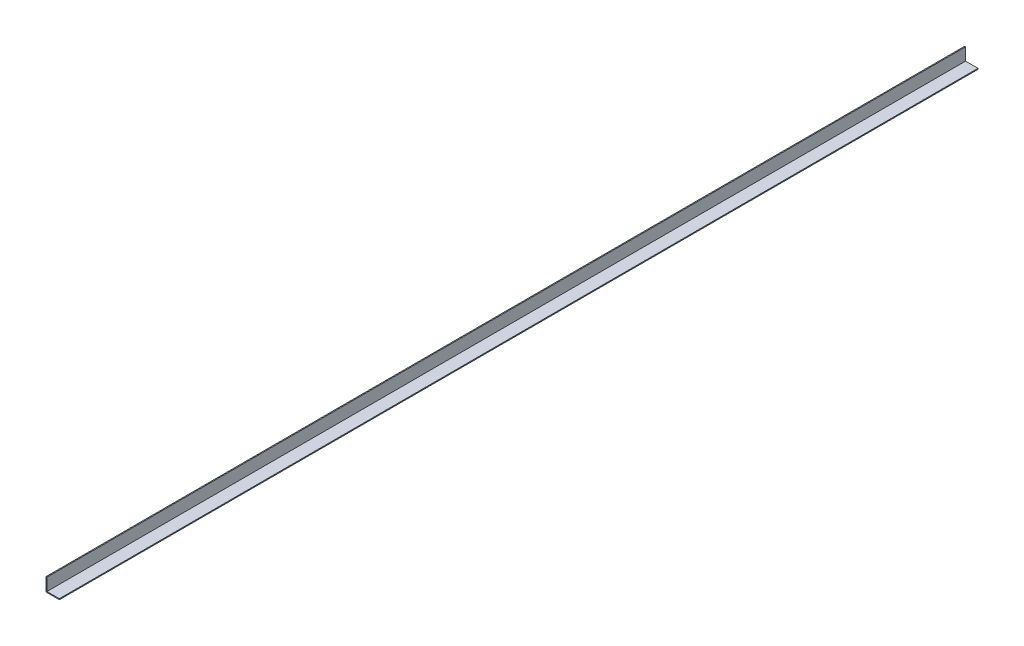
ISO-10303-21;
HEADER;
FILE_DESCRIPTION(('STEP AP214'),'2;1');
FILE_NAME('part.step','',(''),(''),'','','');
FILE_SCHEMA(('AUTOMOTIVE_DESIGN { 1 0 10303 214 1 1 1 1 }'));
ENDSEC;
DATA;
#1=APPLICATION_CONTEXT('core data for automotive mechanical design processes');
#2=APPLICATION_PROTOCOL_DEFINITION('international standard','automotive_design',2000,#1);
#3=PRODUCT_CONTEXT('',#1,'mechanical');
#4=PRODUCT('Part','Part','',(#3));
#5=PRODUCT_RELATED_PRODUCT_CATEGORY('part','',(#4));
#6=PRODUCT_DEFINITION_FORMATION('','',#4);
#7=PRODUCT_DEFINITION_CONTEXT('part definition',#1,'design');
#8=PRODUCT_DEFINITION('design','',#6,#7);
#9=PRODUCT_DEFINITION_SHAPE('','',#8);
#10=(LENGTH_UNIT() NAMED_UNIT(*) SI_UNIT(.MILLI.,.METRE.));
#11=(NAMED_UNIT(*) PLANE_ANGLE_UNIT() SI_UNIT($,.RADIAN.));
#12=(NAMED_UNIT(*) SI_UNIT($,.STERADIAN.) SOLID_ANGLE_UNIT());
#13=UNCERTAINTY_MEASURE_WITH_UNIT(LENGTH_MEASURE(1.E-05),#10,'distance_accuracy_value','');
#14=(GEOMETRIC_REPRESENTATION_CONTEXT(3) GLOBAL_UNCERTAINTY_ASSIGNED_CONTEXT((#13)) GLOBAL_UNIT_ASSIGNED_CONTEXT((#10,
#11,#12)) REPRESENTATION_CONTEXT('',''));
#15=CARTESIAN_POINT('',(0.,0.,0.));
#16=DIRECTION('',(0.,0.,1.));
#17=DIRECTION('',(1.,0.,0.));
#18=AXIS2_PLACEMENT_3D('',#15,#16,#17);
#19=CARTESIAN_POINT('',(6.35,88.9,-6100.));
#20=DIRECTION('',(0.,1.,0.));
#21=DIRECTION('',(0.,0.,1.));
#22=AXIS2_PLACEMENT_3D('',#19,#20,#21);
#23=PLANE('',#22);
#24=DIRECTION('',(-1.,0.,0.));
#25=VECTOR('',#24,1.);
#26=CARTESIAN_POINT('',(6.35,88.9,0.));
#27=LINE('',#26,#25);
#28=CARTESIAN_POINT('',(6.35,88.9,0.));
#29=VERTEX_POINT('',#28);
#30=CARTESIAN_POINT('',(0.,88.9,0.));
#31=VERTEX_POINT('',#30);
#32=EDGE_CURVE('E118',#29,#31,#27,.T.);
#33=ORIENTED_EDGE('',*,*,#32,.F.);
#34=DIRECTION('',(0.,0.,1.));
#35=VECTOR('',#34,1.);
#36=CARTESIAN_POINT('',(6.35,88.9,-6100.));
#37=LINE('',#36,#35);
#38=CARTESIAN_POINT('',(6.35,88.9,-6100.));
#39=VERTEX_POINT('',#38);
#40=EDGE_CURVE('E11',#39,#29,#37,.T.);
#41=ORIENTED_EDGE('',*,*,#40,.F.);
#42=DIRECTION('',(-1.,0.,0.));
#43=VECTOR('',#42,1.);
#44=CARTESIAN_POINT('',(6.35,88.9,-6100.));
#45=LINE('',#44,#43);
#46=CARTESIAN_POINT('',(0.,88.9,-6100.));
#47=VERTEX_POINT('',#46);
#48=EDGE_CURVE('E132',#39,#47,#45,.T.);
#49=ORIENTED_EDGE('',*,*,#48,.T.);
#50=DIRECTION('',(0.,0.,1.));
#51=VECTOR('',#50,1.);
#52=CARTESIAN_POINT('',(0.,88.9,-6100.));
#53=LINE('',#52,#51);
#54=EDGE_CURVE('E36',#47,#31,#53,.T.);
#55=ORIENTED_EDGE('',*,*,#54,.T.);
#56=EDGE_LOOP('',(#33,#41,#49,#55));
#57=FACE_BOUND('',#56,.T.);
#58=ADVANCED_FACE('F33',(#57),#23,.T.);
#59=CARTESIAN_POINT('',(6.35,6.35,-6100.));
#60=DIRECTION('',(1.,0.,0.));
#61=DIRECTION('',(0.,0.,-1.));
#62=AXIS2_PLACEMENT_3D('',#59,#60,#61);
#63=PLANE('',#62);
#64=DIRECTION('',(0.,1.,0.));
#65=VECTOR('',#64,1.);
#66=CARTESIAN_POINT('',(6.35,6.35,0.));
#67=LINE('',#66,#65);
#68=CARTESIAN_POINT('',(6.35,6.35,0.));
#69=VERTEX_POINT('',#68);
#70=EDGE_CURVE('E130',#69,#29,#67,.T.);
#71=ORIENTED_EDGE('',*,*,#70,.F.);
#72=DIRECTION('',(0.,0.,1.));
#73=VECTOR('',#72,1.);
#74=CARTESIAN_POINT('',(6.35,6.35,-6100.));
#75=LINE('',#74,#73);
#76=CARTESIAN_POINT('',(6.35,6.35,-6100.));
#77=VERTEX_POINT('',#76);
#78=EDGE_CURVE('E42',#77,#69,#75,.T.);
#79=ORIENTED_EDGE('',*,*,#78,.F.);
#80=DIRECTION('',(0.,1.,0.));
#81=VECTOR('',#80,1.);
#82=CARTESIAN_POINT('',(6.35,6.35,-6100.));
#83=LINE('',#82,#81);
#84=EDGE_CURVE('E108',#77,#39,#83,.T.);
#85=ORIENTED_EDGE('',*,*,#84,.T.);
#86=ORIENTED_EDGE('',*,*,#40,.T.);
#87=EDGE_LOOP('',(#71,#79,#85,#86));
#88=FACE_BOUND('',#87,.T.);
#89=ADVANCED_FACE('F140',(#88),#63,.T.);
#90=CARTESIAN_POINT('',(88.9,6.35,-6100.));
#91=DIRECTION('',(0.,1.,0.));
#92=DIRECTION('',(-1.,0.,0.));
#93=AXIS2_PLACEMENT_3D('',#90,#91,#92);
#94=PLANE('',#93);
#95=DIRECTION('',(-1.,0.,0.));
#96=VECTOR('',#95,1.);
#97=CARTESIAN_POINT('',(88.9,6.35,0.));
#98=LINE('',#97,#96);
#99=CARTESIAN_POINT('',(88.9,6.35,0.));
#100=VERTEX_POINT('',#99);
#101=EDGE_CURVE('E95',#100,#69,#98,.T.);
#102=ORIENTED_EDGE('',*,*,#101,.F.);
#103=DIRECTION('',(0.,0.,1.));
#104=VECTOR('',#103,1.);
#105=CARTESIAN_POINT('',(88.9,6.35,-6100.));
#106=LINE('',#105,#104);
#107=CARTESIAN_POINT('',(88.9,6.35,-6100.));
#108=VERTEX_POINT('',#107);
#109=EDGE_CURVE('E90',#108,#100,#106,.T.);
#110=ORIENTED_EDGE('',*,*,#109,.F.);
#111=DIRECTION('',(-1.,0.,0.));
#112=VECTOR('',#111,1.);
#113=CARTESIAN_POINT('',(88.9,6.35,-6100.));
#114=LINE('',#113,#112);
#115=EDGE_CURVE('E93',#108,#77,#114,.T.);
#116=ORIENTED_EDGE('',*,*,#115,.T.);
#117=ORIENTED_EDGE('',*,*,#78,.T.);
#118=EDGE_LOOP('',(#102,#110,#116,#117));
#119=FACE_BOUND('',#118,.T.);
#120=ADVANCED_FACE('F92',(#119),#94,.T.);
#121=CARTESIAN_POINT('',(88.9,0.,-6100.));
#122=DIRECTION('',(1.,0.,0.));
#123=DIRECTION('',(0.,0.,-1.));
#124=AXIS2_PLACEMENT_3D('',#121,#122,#123);
#125=PLANE('',#124);
#126=DIRECTION('',(0.,1.,0.));
#127=VECTOR('',#126,1.);
#128=CARTESIAN_POINT('',(88.9,0.,0.));
#129=LINE('',#128,#127);
#130=CARTESIAN_POINT('',(88.9,0.,0.));
#131=VERTEX_POINT('',#130);
#132=EDGE_CURVE('E127',#131,#100,#129,.T.);
#133=ORIENTED_EDGE('',*,*,#132,.F.);
#134=DIRECTION('',(0.,0.,1.));
#135=VECTOR('',#134,1.);
#136=CARTESIAN_POINT('',(88.9,0.,-6100.));
#137=LINE('',#136,#135);
#138=CARTESIAN_POINT('',(88.9,0.,-6100.));
#139=VERTEX_POINT('',#138);
#140=EDGE_CURVE('E100',#139,#131,#137,.T.);
#141=ORIENTED_EDGE('',*,*,#140,.F.);
#142=DIRECTION('',(0.,1.,0.));
#143=VECTOR('',#142,1.);
#144=CARTESIAN_POINT('',(88.9,0.,-6100.));
#145=LINE('',#144,#143);
#146=EDGE_CURVE('E106',#139,#108,#145,.T.);
#147=ORIENTED_EDGE('',*,*,#146,.T.);
#148=ORIENTED_EDGE('',*,*,#109,.T.);
#149=EDGE_LOOP('',(#133,#141,#147,#148));
#150=FACE_BOUND('',#149,.T.);
#151=ADVANCED_FACE('F110',(#150),#125,.T.);
#152=CARTESIAN_POINT('',(0.,0.,-6100.));
#153=DIRECTION('',(0.,-1.,0.));
#154=DIRECTION('',(0.,0.,-1.));
#155=AXIS2_PLACEMENT_3D('',#152,#153,#154);
#156=PLANE('',#155);
#157=DIRECTION('',(1.,0.,0.));
#158=VECTOR('',#157,1.);
#159=CARTESIAN_POINT('',(0.,0.,0.));
#160=LINE('',#159,#158);
#161=CARTESIAN_POINT('',(0.,0.,0.));
#162=VERTEX_POINT('',#161);
#163=EDGE_CURVE('E124',#162,#131,#160,.T.);
#164=ORIENTED_EDGE('',*,*,#163,.F.);
#165=DIRECTION('',(0.,0.,1.));
#166=VECTOR('',#165,1.);
#167=CARTESIAN_POINT('',(0.,0.,-6100.));
#168=LINE('',#167,#166);
#169=CARTESIAN_POINT('',(0.,0.,-6100.));
#170=VERTEX_POINT('',#169);
#171=EDGE_CURVE('E135',#170,#162,#168,.T.);
#172=ORIENTED_EDGE('',*,*,#171,.F.);
#173=DIRECTION('',(1.,0.,0.));
#174=VECTOR('',#173,1.);
#175=CARTESIAN_POINT('',(0.,0.,-6100.));
#176=LINE('',#175,#174);
#177=EDGE_CURVE('E111',#170,#139,#176,.T.);
#178=ORIENTED_EDGE('',*,*,#177,.T.);
#179=ORIENTED_EDGE('',*,*,#140,.T.);
#180=EDGE_LOOP('',(#164,#172,#178,#179));
#181=FACE_BOUND('',#180,.T.);
#182=ADVANCED_FACE('F153',(#181),#156,.T.);
#183=CARTESIAN_POINT('',(0.,88.9,-6100.));
#184=DIRECTION('',(-1.,0.,0.));
#185=DIRECTION('',(0.,-1.,0.));
#186=AXIS2_PLACEMENT_3D('',#183,#184,#185);
#187=PLANE('',#186);
#188=DIRECTION('',(0.,-1.,0.));
#189=VECTOR('',#188,1.);
#190=CARTESIAN_POINT('',(0.,88.9,0.));
#191=LINE('',#190,#189);
#192=EDGE_CURVE('E121',#31,#162,#191,.T.);
#193=ORIENTED_EDGE('',*,*,#192,.F.);
#194=ORIENTED_EDGE('',*,*,#54,.F.);
#195=DIRECTION('',(0.,-1.,0.));
#196=VECTOR('',#195,1.);
#197=CARTESIAN_POINT('',(0.,88.9,-6100.));
#198=LINE('',#197,#196);
#199=EDGE_CURVE('E113',#47,#170,#198,.T.);
#200=ORIENTED_EDGE('',*,*,#199,.T.);
#201=ORIENTED_EDGE('',*,*,#171,.T.);
#202=EDGE_LOOP('',(#193,#194,#200,#201));
#203=FACE_BOUND('',#202,.T.);
#204=ADVANCED_FACE('F137',(#203),#187,.T.);
#205=CARTESIAN_POINT('',(0.,0.,-6100.));
#206=DIRECTION('',(0.,0.,1.));
#207=DIRECTION('',(1.,0.,0.));
#208=AXIS2_PLACEMENT_3D('',#205,#206,#207);
#209=PLANE('',#208);
#210=ORIENTED_EDGE('',*,*,#48,.F.);
#211=ORIENTED_EDGE('',*,*,#84,.F.);
#212=ORIENTED_EDGE('',*,*,#115,.F.);
#213=ORIENTED_EDGE('',*,*,#146,.F.);
#214=ORIENTED_EDGE('',*,*,#177,.F.);
#215=ORIENTED_EDGE('',*,*,#199,.F.);
#216=EDGE_LOOP('',(#210,#211,#212,#213,#214,#215));
#217=FACE_BOUND('',#216,.T.);
#218=ADVANCED_FACE('F104',(#217),#209,.F.);
#219=CARTESIAN_POINT('',(0.,0.,0.));
#220=DIRECTION('',(0.,0.,1.));
#221=DIRECTION('',(1.,0.,0.));
#222=AXIS2_PLACEMENT_3D('',#219,#220,#221);
#223=PLANE('',#222);
#224=ORIENTED_EDGE('',*,*,#32,.T.);
#225=ORIENTED_EDGE('',*,*,#192,.T.);
#226=ORIENTED_EDGE('',*,*,#163,.T.);
#227=ORIENTED_EDGE('',*,*,#132,.T.);
#228=ORIENTED_EDGE('',*,*,#101,.T.);
#229=ORIENTED_EDGE('',*,*,#70,.T.);
#230=EDGE_LOOP('',(#224,#225,#226,#227,#228,#229));
#231=FACE_BOUND('',#230,.T.);
#232=ADVANCED_FACE('F139',(#231),#223,.T.);
#233=CLOSED_SHELL('',(#58,#89,#120,#151,#182,#204,#218,#232));
#234=MANIFOLD_SOLID_BREP('B2',#233);
#235=ADVANCED_BREP_SHAPE_REPRESENTATION('',(#18,#234),#14);
#236=SHAPE_DEFINITION_REPRESENTATION(#9,#235);
ENDSEC;
END-ISO-10303-21;
